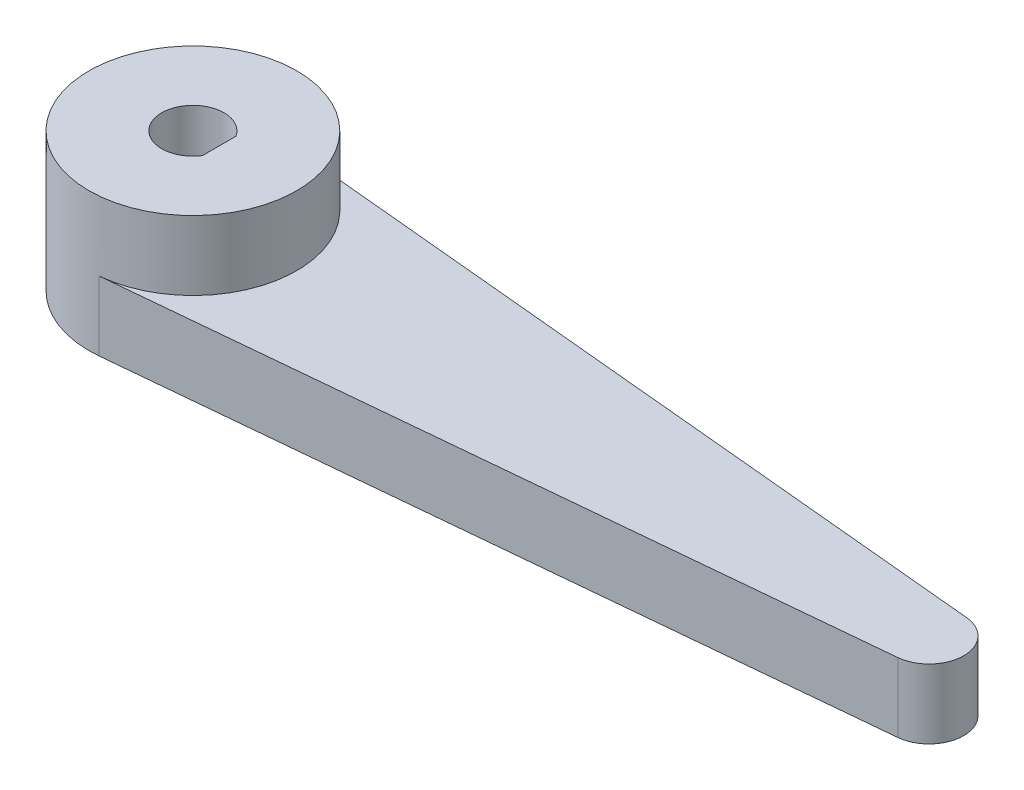
ISO-10303-21;
HEADER;
FILE_DESCRIPTION(('STEP AP214'),'2;1');
FILE_NAME('part.step','',(''),(''),'','','');
FILE_SCHEMA(('AUTOMOTIVE_DESIGN { 1 0 10303 214 1 1 1 1 }'));
ENDSEC;
DATA;
#1=APPLICATION_CONTEXT('core data for automotive mechanical design processes');
#2=APPLICATION_PROTOCOL_DEFINITION('international standard','automotive_design',2000,#1);
#3=PRODUCT_CONTEXT('',#1,'mechanical');
#4=PRODUCT('Part','Part','',(#3));
#5=PRODUCT_RELATED_PRODUCT_CATEGORY('part','',(#4));
#6=PRODUCT_DEFINITION_FORMATION('','',#4);
#7=PRODUCT_DEFINITION_CONTEXT('part definition',#1,'design');
#8=PRODUCT_DEFINITION('design','',#6,#7);
#9=PRODUCT_DEFINITION_SHAPE('','',#8);
#10=(LENGTH_UNIT() NAMED_UNIT(*) SI_UNIT(.MILLI.,.METRE.));
#11=(NAMED_UNIT(*) PLANE_ANGLE_UNIT() SI_UNIT($,.RADIAN.));
#12=(NAMED_UNIT(*) SI_UNIT($,.STERADIAN.) SOLID_ANGLE_UNIT());
#13=UNCERTAINTY_MEASURE_WITH_UNIT(LENGTH_MEASURE(1.E-05),#10,'distance_accuracy_value','');
#14=(GEOMETRIC_REPRESENTATION_CONTEXT(3) GLOBAL_UNCERTAINTY_ASSIGNED_CONTEXT((#13)) GLOBAL_UNIT_ASSIGNED_CONTEXT((#10,
#11,#12)) REPRESENTATION_CONTEXT('',''));
#15=CARTESIAN_POINT('',(0.,0.,0.));
#16=DIRECTION('',(0.,0.,1.));
#17=DIRECTION('',(1.,0.,0.));
#18=AXIS2_PLACEMENT_3D('',#15,#16,#17);
#19=CARTESIAN_POINT('',(0.,5.,0.));
#20=DIRECTION('',(0.,-1.,0.));
#21=DIRECTION('',(0.,0.,-1.));
#22=AXIS2_PLACEMENT_3D('',#19,#20,#21);
#23=CYLINDRICAL_SURFACE('',#22,7.5);
#24=CARTESIAN_POINT('',(0.,0.,0.));
#25=DIRECTION('',(0.,1.,0.));
#26=DIRECTION('',(0.,0.,1.));
#27=AXIS2_PLACEMENT_3D('',#24,#25,#26);
#28=CIRCLE('',#27,7.5);
#29=CARTESIAN_POINT('',(0.705615188968486,0.,-7.46673336909099));
#30=VERTEX_POINT('',#29);
#31=CARTESIAN_POINT('',(0.705615188968486,0.,7.46673336909099));
#32=VERTEX_POINT('',#31);
#33=EDGE_CURVE('E108',#30,#32,#28,.T.);
#34=ORIENTED_EDGE('',*,*,#33,.T.);
#35=DIRECTION('',(0.,-1.,0.));
#36=VECTOR('',#35,1.);
#37=CARTESIAN_POINT('',(0.705615188968486,5.,7.46673336909099));
#38=LINE('',#37,#36);
#39=CARTESIAN_POINT('',(0.705615188968486,5.,7.466733369091));
#40=VERTEX_POINT('',#39);
#41=EDGE_CURVE('E11',#40,#32,#38,.T.);
#42=ORIENTED_EDGE('',*,*,#41,.F.);
#43=CARTESIAN_POINT('',(0.,5.,0.));
#44=DIRECTION('',(0.,1.,0.));
#45=DIRECTION('',(0.,0.,1.));
#46=AXIS2_PLACEMENT_3D('',#43,#44,#45);
#47=CIRCLE('',#46,7.5);
#48=CARTESIAN_POINT('',(0.705615188968486,5.,-7.46673336909099));
#49=VERTEX_POINT('',#48);
#50=EDGE_CURVE('E103',#40,#49,#47,.T.);
#51=ORIENTED_EDGE('',*,*,#50,.T.);
#52=DIRECTION('',(0.,-1.,0.));
#53=VECTOR('',#52,1.);
#54=CARTESIAN_POINT('',(0.705615188968486,5.,-7.46673336909099));
#55=LINE('',#54,#53);
#56=EDGE_CURVE('E118',#49,#30,#55,.T.);
#57=ORIENTED_EDGE('',*,*,#56,.T.);
#58=EDGE_LOOP('',(#34,#42,#51,#57));
#59=FACE_BOUND('',#58,.T.);
#60=CARTESIAN_POINT('',(0.,10.,0.));
#61=DIRECTION('',(0.,1.,0.));
#62=DIRECTION('',(0.,0.,1.));
#63=AXIS2_PLACEMENT_3D('',#60,#61,#62);
#64=CIRCLE('',#63,7.5);
#65=CARTESIAN_POINT('',(0.,10.,7.5));
#66=VERTEX_POINT('',#65);
#67=EDGE_CURVE('E105',#66,#66,#64,.T.);
#68=ORIENTED_EDGE('',*,*,#67,.F.);
#69=EDGE_LOOP('',(#68));
#70=FACE_BOUND('',#69,.T.);
#71=ADVANCED_FACE('F35',(#59,#70),#23,.T.);
#72=CARTESIAN_POINT('',(0.705615188968486,5.,7.46673336909099));
#73=DIRECTION('',(-0.0940820251957981,0.,-0.995564449212133));
#74=DIRECTION('',(-0.995564449212133,0.,0.0940820251957981));
#75=AXIS2_PLACEMENT_3D('',#72,#73,#74);
#76=PLANE('',#75);
#77=DIRECTION('',(0.995564449212133,0.,-0.0940820251957981));
#78=VECTOR('',#77,1.);
#79=CARTESIAN_POINT('',(0.705615188968486,0.,7.46673336909099));
#80=LINE('',#79,#78);
#81=CARTESIAN_POINT('',(53.3803195478689,0.,2.48891112303033));
#82=VERTEX_POINT('',#81);
#83=EDGE_CURVE('E121',#32,#82,#80,.T.);
#84=ORIENTED_EDGE('',*,*,#83,.T.);
#85=DIRECTION('',(0.,-1.,0.));
#86=VECTOR('',#85,1.);
#87=CARTESIAN_POINT('',(53.3803195478689,5.,2.48891112303033));
#88=LINE('',#87,#86);
#89=CARTESIAN_POINT('',(53.3803195478689,5.,2.48891112303033));
#90=VERTEX_POINT('',#89);
#91=EDGE_CURVE('E42',#90,#82,#88,.T.);
#92=ORIENTED_EDGE('',*,*,#91,.F.);
#93=DIRECTION('',(0.995564449212133,0.,-0.0940820251957981));
#94=VECTOR('',#93,1.);
#95=CARTESIAN_POINT('',(0.705615188968486,5.,7.46673336909099));
#96=LINE('',#95,#94);
#97=EDGE_CURVE('E111',#40,#90,#96,.T.);
#98=ORIENTED_EDGE('',*,*,#97,.F.);
#99=ORIENTED_EDGE('',*,*,#41,.T.);
#100=EDGE_LOOP('',(#84,#92,#98,#99));
#101=FACE_BOUND('',#100,.T.);
#102=ADVANCED_FACE('F150',(#101),#76,.F.);
#103=CARTESIAN_POINT('',(53.1451144848794,5.,0.));
#104=DIRECTION('',(0.,-1.,0.));
#105=DIRECTION('',(0.,0.,-1.));
#106=AXIS2_PLACEMENT_3D('',#103,#104,#105);
#107=CYLINDRICAL_SURFACE('',#106,2.5);
#108=CARTESIAN_POINT('',(53.1451144848794,0.,0.));
#109=DIRECTION('',(0.,1.,0.));
#110=DIRECTION('',(0.,0.,1.));
#111=AXIS2_PLACEMENT_3D('',#108,#109,#110);
#112=CIRCLE('',#111,2.5);
#113=CARTESIAN_POINT('',(53.3803195478689,0.,-2.48891112303033));
#114=VERTEX_POINT('',#113);
#115=EDGE_CURVE('E123',#82,#114,#112,.T.);
#116=ORIENTED_EDGE('',*,*,#115,.T.);
#117=DIRECTION('',(0.,-1.,0.));
#118=VECTOR('',#117,1.);
#119=CARTESIAN_POINT('',(53.3803195478689,5.,-2.48891112303033));
#120=LINE('',#119,#118);
#121=CARTESIAN_POINT('',(53.3803195478689,5.,-2.48891112303033));
#122=VERTEX_POINT('',#121);
#123=EDGE_CURVE('E128',#122,#114,#120,.T.);
#124=ORIENTED_EDGE('',*,*,#123,.F.);
#125=CARTESIAN_POINT('',(53.1451144848794,5.,0.));
#126=DIRECTION('',(0.,1.,0.));
#127=DIRECTION('',(0.,0.,1.));
#128=AXIS2_PLACEMENT_3D('',#125,#126,#127);
#129=CIRCLE('',#128,2.5);
#130=EDGE_CURVE('E113',#90,#122,#129,.T.);
#131=ORIENTED_EDGE('',*,*,#130,.F.);
#132=ORIENTED_EDGE('',*,*,#91,.T.);
#133=EDGE_LOOP('',(#116,#124,#131,#132));
#134=FACE_BOUND('',#133,.T.);
#135=ADVANCED_FACE('F135',(#134),#107,.T.);
#136=CARTESIAN_POINT('',(0.705615188968486,5.,-7.46673336909099));
#137=DIRECTION('',(-0.0940820251957982,0.,0.995564449212133));
#138=DIRECTION('',(0.995564449212133,0.,0.0940820251957982));
#139=AXIS2_PLACEMENT_3D('',#136,#137,#138);
#140=PLANE('',#139);
#141=DIRECTION('',(-0.995564449212133,0.,-0.0940820251957982));
#142=VECTOR('',#141,1.);
#143=CARTESIAN_POINT('',(0.705615188968486,0.,-7.46673336909099));
#144=LINE('',#143,#142);
#145=EDGE_CURVE('E114',#114,#30,#144,.T.);
#146=ORIENTED_EDGE('',*,*,#145,.T.);
#147=ORIENTED_EDGE('',*,*,#56,.F.);
#148=DIRECTION('',(-0.995564449212133,0.,-0.0940820251957982));
#149=VECTOR('',#148,1.);
#150=CARTESIAN_POINT('',(0.705615188968486,5.,-7.46673336909099));
#151=LINE('',#150,#149);
#152=EDGE_CURVE('E116',#122,#49,#151,.T.);
#153=ORIENTED_EDGE('',*,*,#152,.F.);
#154=ORIENTED_EDGE('',*,*,#123,.T.);
#155=EDGE_LOOP('',(#146,#147,#153,#154));
#156=FACE_BOUND('',#155,.T.);
#157=ADVANCED_FACE('F143',(#156),#140,.F.);
#158=CARTESIAN_POINT('',(0.,5.,0.));
#159=DIRECTION('',(0.,1.,0.));
#160=DIRECTION('',(0.,0.,1.));
#161=AXIS2_PLACEMENT_3D('',#158,#159,#160);
#162=PLANE('',#161);
#163=ORIENTED_EDGE('',*,*,#50,.F.);
#164=ORIENTED_EDGE('',*,*,#97,.T.);
#165=ORIENTED_EDGE('',*,*,#130,.T.);
#166=ORIENTED_EDGE('',*,*,#152,.T.);
#167=EDGE_LOOP('',(#163,#164,#165,#166));
#168=FACE_BOUND('',#167,.T.);
#169=ADVANCED_FACE('F149',(#168),#162,.T.);
#170=CARTESIAN_POINT('',(0.,0.,0.));
#171=DIRECTION('',(0.,1.,0.));
#172=DIRECTION('',(0.,0.,1.));
#173=AXIS2_PLACEMENT_3D('',#170,#171,#172);
#174=PLANE('',#173);
#175=DIRECTION('',(0.,0.,-1.));
#176=VECTOR('',#175,1.);
#177=CARTESIAN_POINT('',(1.89738878401611,0.,-1.20930385027496));
#178=LINE('',#177,#176);
#179=CARTESIAN_POINT('',(1.89738878401611,0.,1.20930385027496));
#180=VERTEX_POINT('',#179);
#181=CARTESIAN_POINT('',(1.89738878401611,0.,-1.20930385027496));
#182=VERTEX_POINT('',#181);
#183=EDGE_CURVE('E90',#180,#182,#178,.T.);
#184=ORIENTED_EDGE('',*,*,#183,.T.);
#185=CARTESIAN_POINT('',(0.,0.,0.));
#186=DIRECTION('',(0.,1.,0.));
#187=DIRECTION('',(0.,0.,1.));
#188=AXIS2_PLACEMENT_3D('',#185,#186,#187);
#189=CIRCLE('',#188,2.25);
#190=EDGE_CURVE('E49',#182,#180,#189,.T.);
#191=ORIENTED_EDGE('',*,*,#190,.T.);
#192=EDGE_LOOP('',(#184,#191));
#193=FACE_BOUND('',#192,.T.);
#194=ORIENTED_EDGE('',*,*,#33,.F.);
#195=ORIENTED_EDGE('',*,*,#145,.F.);
#196=ORIENTED_EDGE('',*,*,#115,.F.);
#197=ORIENTED_EDGE('',*,*,#83,.F.);
#198=EDGE_LOOP('',(#194,#195,#196,#197));
#199=FACE_BOUND('',#198,.T.);
#200=ADVANCED_FACE('F96',(#193,#199),#174,.F.);
#201=CARTESIAN_POINT('',(0.,10.,0.));
#202=DIRECTION('',(0.,1.,0.));
#203=DIRECTION('',(0.,0.,1.));
#204=AXIS2_PLACEMENT_3D('',#201,#202,#203);
#205=PLANE('',#204);
#206=CARTESIAN_POINT('',(0.,10.,0.));
#207=DIRECTION('',(0.,1.,0.));
#208=DIRECTION('',(0.,0.,1.));
#209=AXIS2_PLACEMENT_3D('',#206,#207,#208);
#210=CIRCLE('',#209,2.25);
#211=CARTESIAN_POINT('',(1.89738878401611,10.,-1.20930385027496));
#212=VERTEX_POINT('',#211);
#213=CARTESIAN_POINT('',(1.89738878401611,10.,1.20930385027496));
#214=VERTEX_POINT('',#213);
#215=EDGE_CURVE('E54',#212,#214,#210,.T.);
#216=ORIENTED_EDGE('',*,*,#215,.F.);
#217=DIRECTION('',(0.,0.,-1.));
#218=VECTOR('',#217,1.);
#219=CARTESIAN_POINT('',(1.89738878401611,10.,-1.20930385027496));
#220=LINE('',#219,#218);
#221=EDGE_CURVE('E98',#214,#212,#220,.T.);
#222=ORIENTED_EDGE('',*,*,#221,.F.);
#223=EDGE_LOOP('',(#216,#222));
#224=FACE_BOUND('',#223,.T.);
#225=ORIENTED_EDGE('',*,*,#67,.T.);
#226=EDGE_LOOP('',(#225));
#227=FACE_BOUND('',#226,.T.);
#228=ADVANCED_FACE('F162',(#224,#227),#205,.T.);
#229=CARTESIAN_POINT('',(0.,0.,0.));
#230=DIRECTION('',(0.,1.,0.));
#231=DIRECTION('',(0.,0.,1.));
#232=AXIS2_PLACEMENT_3D('',#229,#230,#231);
#233=CYLINDRICAL_SURFACE('',#232,2.25);
#234=ORIENTED_EDGE('',*,*,#215,.T.);
#235=DIRECTION('',(0.,1.,0.));
#236=VECTOR('',#235,1.);
#237=CARTESIAN_POINT('',(1.89738878401611,0.,1.20930385027496));
#238=LINE('',#237,#236);
#239=EDGE_CURVE('E83',#180,#214,#238,.T.);
#240=ORIENTED_EDGE('',*,*,#239,.F.);
#241=ORIENTED_EDGE('',*,*,#190,.F.);
#242=DIRECTION('',(0.,1.,0.));
#243=VECTOR('',#242,1.);
#244=CARTESIAN_POINT('',(1.89738878401611,0.,-1.20930385027496));
#245=LINE('',#244,#243);
#246=EDGE_CURVE('E89',#182,#212,#245,.T.);
#247=ORIENTED_EDGE('',*,*,#246,.T.);
#248=EDGE_LOOP('',(#234,#240,#241,#247));
#249=FACE_BOUND('',#248,.T.);
#250=ADVANCED_FACE('F85',(#249),#233,.F.);
#251=CARTESIAN_POINT('',(1.89738878401611,0.,-1.20930385027496));
#252=DIRECTION('',(1.,0.,0.));
#253=DIRECTION('',(0.,0.,-1.));
#254=AXIS2_PLACEMENT_3D('',#251,#252,#253);
#255=PLANE('',#254);
#256=ORIENTED_EDGE('',*,*,#221,.T.);
#257=ORIENTED_EDGE('',*,*,#246,.F.);
#258=ORIENTED_EDGE('',*,*,#183,.F.);
#259=ORIENTED_EDGE('',*,*,#239,.T.);
#260=EDGE_LOOP('',(#256,#257,#258,#259));
#261=FACE_BOUND('',#260,.T.);
#262=ADVANCED_FACE('F93',(#261),#255,.F.);
#263=CLOSED_SHELL('',(#71,#102,#135,#157,#169,#200,#228,#250,#262));
#264=MANIFOLD_SOLID_BREP('B2',#263);
#265=ADVANCED_BREP_SHAPE_REPRESENTATION('',(#18,#264),#14);
#266=SHAPE_DEFINITION_REPRESENTATION(#9,#265);
ENDSEC;
END-ISO-10303-21;
